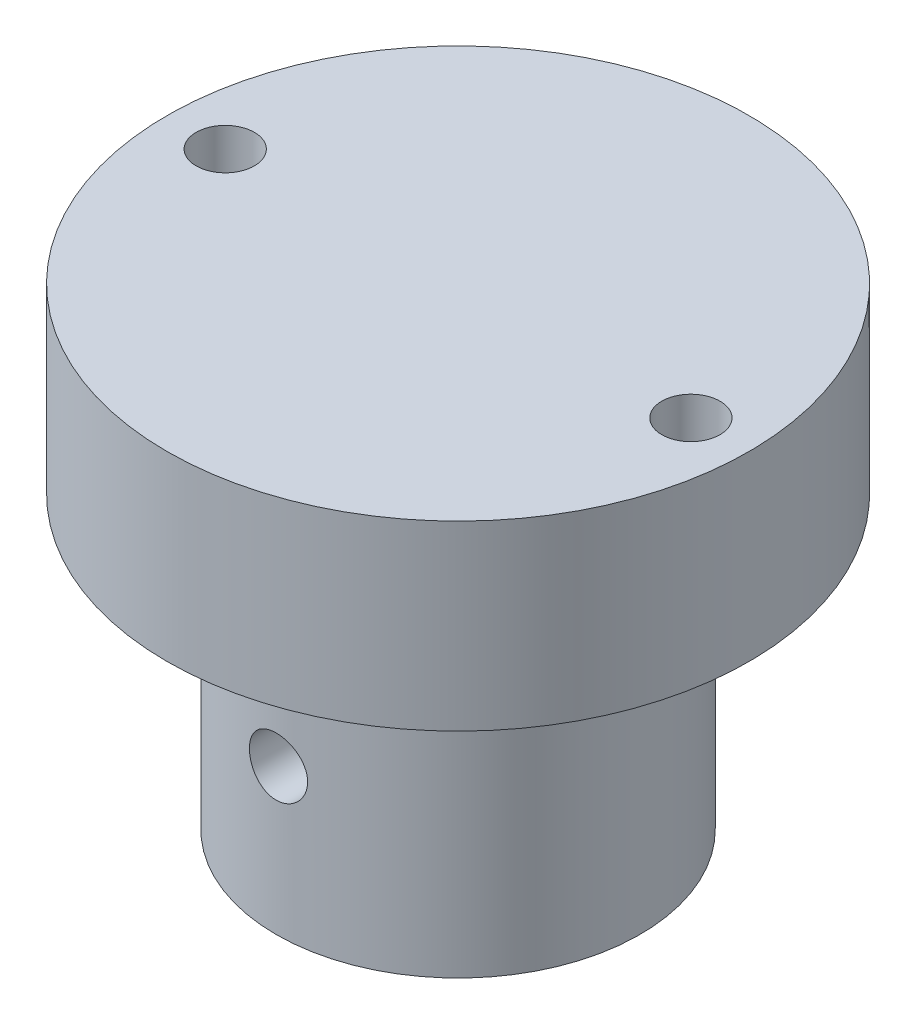
ISO-10303-21;
HEADER;
FILE_DESCRIPTION(('STEP AP214'),'2;1');
FILE_NAME('part.step','',(''),(''),'','','');
FILE_SCHEMA(('AUTOMOTIVE_DESIGN { 1 0 10303 214 1 1 1 1 }'));
ENDSEC;
DATA;
#1=APPLICATION_CONTEXT('core data for automotive mechanical design processes');
#2=APPLICATION_PROTOCOL_DEFINITION('international standard','automotive_design',2000,#1);
#3=PRODUCT_CONTEXT('',#1,'mechanical');
#4=PRODUCT('Part','Part','',(#3));
#5=PRODUCT_RELATED_PRODUCT_CATEGORY('part','',(#4));
#6=PRODUCT_DEFINITION_FORMATION('','',#4);
#7=PRODUCT_DEFINITION_CONTEXT('part definition',#1,'design');
#8=PRODUCT_DEFINITION('design','',#6,#7);
#9=PRODUCT_DEFINITION_SHAPE('','',#8);
#10=(LENGTH_UNIT() NAMED_UNIT(*) SI_UNIT(.MILLI.,.METRE.));
#11=(NAMED_UNIT(*) PLANE_ANGLE_UNIT() SI_UNIT($,.RADIAN.));
#12=(NAMED_UNIT(*) SI_UNIT($,.STERADIAN.) SOLID_ANGLE_UNIT());
#13=UNCERTAINTY_MEASURE_WITH_UNIT(LENGTH_MEASURE(1.E-05),#10,'distance_accuracy_value','');
#14=(GEOMETRIC_REPRESENTATION_CONTEXT(3) GLOBAL_UNCERTAINTY_ASSIGNED_CONTEXT((#13)) GLOBAL_UNIT_ASSIGNED_CONTEXT((#10,
#11,#12)) REPRESENTATION_CONTEXT('',''));
#15=CARTESIAN_POINT('',(0.,0.,0.));
#16=DIRECTION('',(0.,0.,1.));
#17=DIRECTION('',(1.,0.,0.));
#18=AXIS2_PLACEMENT_3D('',#15,#16,#17);
#19=CARTESIAN_POINT('',(0.,10.16,0.));
#20=DIRECTION('',(0.,-1.,0.));
#21=DIRECTION('',(0.,0.,-1.));
#22=AXIS2_PLACEMENT_3D('',#19,#20,#21);
#23=CYLINDRICAL_SURFACE('',#22,6.35);
#24=CARTESIAN_POINT('',(0.,0.,0.));
#25=DIRECTION('',(0.,1.,0.));
#26=DIRECTION('',(0.,0.,1.));
#27=AXIS2_PLACEMENT_3D('',#24,#25,#26);
#28=CIRCLE('',#27,6.35);
#29=CARTESIAN_POINT('',(0.,0.,6.35));
#30=VERTEX_POINT('',#29);
#31=EDGE_CURVE('E46',#30,#30,#28,.T.);
#32=ORIENTED_EDGE('',*,*,#31,.T.);
#33=EDGE_LOOP('',(#32));
#34=FACE_BOUND('',#33,.T.);
#35=CARTESIAN_POINT('',(-1.016,5.08,6.26819304106056));
#36=CARTESIAN_POINT('',(-1.01599769504324,5.13667589140187,6.26819403551404));
#37=CARTESIAN_POINT('',(-1.01124159204673,5.19338353794778,6.26897004691585));
#38=CARTESIAN_POINT('',(-0.992349783147829,5.30521003843499,6.27198771662539));
#39=CARTESIAN_POINT('',(-0.978205221741949,5.36032734104515,6.2742307586555));
#40=CARTESIAN_POINT('',(-0.94097334251936,5.46733847506112,6.27992208580791));
#41=CARTESIAN_POINT('',(-0.917893246383186,5.51923487039731,6.28336939742283));
#42=CARTESIAN_POINT('',(-0.86346305157436,5.61841217203581,6.29107968557929));
#43=CARTESIAN_POINT('',(-0.832113968966905,5.66569364442702,6.29534256188933));
#44=CARTESIAN_POINT('',(-0.761731472401225,5.75473521786042,6.30424698435201));
#45=CARTESIAN_POINT('',(-0.722637613434505,5.7964472668791,6.30889132920186));
#46=CARTESIAN_POINT('',(-0.6380058858614,5.87274896550724,6.31801047882019));
#47=CARTESIAN_POINT('',(-0.592467647153622,5.90733820577275,6.32248527383266));
#48=CARTESIAN_POINT('',(-0.495929877850886,5.96859154833621,6.33079062048891));
#49=CARTESIAN_POINT('',(-0.444901748992711,5.99521111869177,6.33461750200122));
#50=CARTESIAN_POINT('',(-0.339027005912608,6.03948344504246,6.34116475032308));
#51=CARTESIAN_POINT('',(-0.284180620955612,6.05713673888526,6.34388518350168));
#52=CARTESIAN_POINT('',(-0.172722097504602,6.08282895413612,6.34789326388865));
#53=CARTESIAN_POINT('',(-0.116128984586578,6.09094850865779,6.34919292097404));
#54=CARTESIAN_POINT('',(-0.00236972222130401,6.09759334610754,6.35025423457713));
#55=CARTESIAN_POINT('',(0.0547963909724093,6.09611923224563,6.35001598779185));
#56=CARTESIAN_POINT('',(0.167528095717094,6.08368176927201,6.34803788122686));
#57=CARTESIAN_POINT('',(0.223103535159279,6.07280518520236,6.34631175189527));
#58=CARTESIAN_POINT('',(0.331630194115818,6.04200797457068,6.34156712875674));
#59=CARTESIAN_POINT('',(0.384581338647916,6.02208708975682,6.33854859804658));
#60=CARTESIAN_POINT('',(0.486616241095792,5.97367946298034,6.33153486057529));
#61=CARTESIAN_POINT('',(0.535682593094869,5.94515665048293,6.32753555457914));
#62=CARTESIAN_POINT('',(0.628365353157727,5.88038121426257,6.31900517323919));
#63=CARTESIAN_POINT('',(0.6719813535878,5.84412801292924,6.31447405817029));
#64=CARTESIAN_POINT('',(0.753037465593561,5.7644387817114,6.30532473766966));
#65=CARTESIAN_POINT('',(0.790403046173726,5.72092694987282,6.30070612498814));
#66=CARTESIAN_POINT('',(0.8573144186034,5.62821187981386,6.29195154361697));
#67=CARTESIAN_POINT('',(0.886860148838747,5.57900859675378,6.28781557873035));
#68=CARTESIAN_POINT('',(0.937305880666645,5.47622450094184,6.28049450273244));
#69=CARTESIAN_POINT('',(0.958197450743346,5.42263947974057,6.27731031975346));
#70=CARTESIAN_POINT('',(0.990662758380679,5.31265860420519,6.27226911110825));
#71=CARTESIAN_POINT('',(1.00223724835111,5.25626297723492,6.27041197827617));
#72=CARTESIAN_POINT('',(1.01563601798795,5.14292706608188,6.26825571297972));
#73=CARTESIAN_POINT('',(1.0175662979846,5.08599962494034,6.26793964349315));
#74=CARTESIAN_POINT('',(1.01190383114509,4.97263472513705,6.26885623915126));
#75=CARTESIAN_POINT('',(1.00431142214299,4.91619724916445,6.27008884935381));
#76=CARTESIAN_POINT('',(0.979909280740693,4.80574761203425,6.27394830907495));
#77=CARTESIAN_POINT('',(0.963153030988743,4.75172332702417,6.2765670658449));
#78=CARTESIAN_POINT('',(0.920954759109688,4.64724984339553,6.2828970086701));
#79=CARTESIAN_POINT('',(0.895512254331345,4.59680084362561,6.28660825542792));
#80=CARTESIAN_POINT('',(0.836411663304454,4.50043682431462,6.29474459515927));
#81=CARTESIAN_POINT('',(0.802685364876786,4.45456413958641,6.29917550591062));
#82=CARTESIAN_POINT('',(0.728068669578291,4.36909156119654,6.30823469948976));
#83=CARTESIAN_POINT('',(0.687177809748396,4.32949207321086,6.31286299505751));
#84=CARTESIAN_POINT('',(0.598924255479659,4.25730553561683,6.32184877776935));
#85=CARTESIAN_POINT('',(0.551503536204841,4.22478899561172,6.3262032598522));
#86=CARTESIAN_POINT('',(0.451811058473387,4.16818417263784,6.3341032066333));
#87=CARTESIAN_POINT('',(0.399539447287974,4.14409563390402,6.33764869588096));
#88=CARTESIAN_POINT('',(0.291842838763925,4.10514153619851,6.34351807238694));
#89=CARTESIAN_POINT('',(0.236431715654078,4.09023840003212,6.34584693079896));
#90=CARTESIAN_POINT('',(0.123853069651673,4.06995689111261,6.34904160254437));
#91=CARTESIAN_POINT('',(0.0666856798149288,4.06457779861375,6.34990752643362));
#92=CARTESIAN_POINT('',(-0.0471008256588229,4.06351648657573,6.35007738794596));
#93=CARTESIAN_POINT('',(-0.103718941549757,4.06772673910333,6.34939864639168));
#94=CARTESIAN_POINT('',(-0.215430776217704,4.08549288984209,6.34659062021428));
#95=CARTESIAN_POINT('',(-0.270524501947229,4.09904874542205,6.34446134220797));
#96=CARTESIAN_POINT('',(-0.377587318541396,4.13508130301258,6.33899051703869));
#97=CARTESIAN_POINT('',(-0.42955931478101,4.15754955740056,6.33565011809443));
#98=CARTESIAN_POINT('',(-0.529012504739116,4.21075736987234,6.32812262419089));
#99=CARTESIAN_POINT('',(-0.576493512733801,4.24149726982623,6.3239354942377));
#100=CARTESIAN_POINT('',(-0.666160156866185,4.31076014675583,6.31512349568329));
#101=CARTESIAN_POINT('',(-0.708284350860755,4.34936214351927,6.31049445883438));
#102=CARTESIAN_POINT('',(-0.785495604939363,4.43308733338062,6.30135003139344));
#103=CARTESIAN_POINT('',(-0.820581013885812,4.47821205229844,6.29683466768324));
#104=CARTESIAN_POINT('',(-0.882925294022889,4.57404682035764,6.28839740566688));
#105=CARTESIAN_POINT('',(-0.910132119839209,4.62479108075766,6.28447953129439));
#106=CARTESIAN_POINT('',(-0.955594646553645,4.73017001117662,6.27772822250236));
#107=CARTESIAN_POINT('',(-0.973859433240997,4.78480066739026,6.27489368797267));
#108=CARTESIAN_POINT('',(-0.996878807164912,4.8797148827213,6.27126949983991));
#109=CARTESIAN_POINT('',(-1.00403797217713,4.91941880908197,6.27012211869688));
#110=CARTESIAN_POINT('',(-1.0135993503463,4.99940981043834,6.26858354172928));
#111=CARTESIAN_POINT('',(-1.01600163909125,5.03969687615756,6.26819233388894));
#112=CARTESIAN_POINT('',(-1.016,5.08,6.26819304106056));
#113=B_SPLINE_CURVE_WITH_KNOTS('',3,(#35,#36,#37,#38,#39,#40,#41,#42,#43,#44,#45,#46,#47,#48,
#49,#50,#51,#52,#53,#54,#55,#56,#57,#58,#59,#60,#61,#62,#63,#64,#65,#66,#67,#68,#69,#70,#71,#72,
#73,#74,#75,#76,#77,#78,#79,#80,#81,#82,#83,#84,#85,#86,#87,#88,#89,#90,#91,#92,#93,#94,#95,#96,
#97,#98,#99,#100,#101,#102,#103,#104,#105,#106,#107,#108,#109,#110,#111,#112),.UNSPECIFIED.,.T.,
.F.,(4,2,2,2,2,2,2,2,2,2,2,2,2,2,2,2,2,2,2,2,2,2,2,2,2,2,2,2,2,2,2,2,2,2,2,2,2,2,4),(0.,
0.169880321882361,0.339921108625201,0.509824754680403,0.679707533265704,0.850972488209638,
1.02224728291215,1.19446197226048,1.36666632998338,1.53740350435707,1.70812994359012,
1.87729755271594,2.04646999257357,2.21636192832832,2.38626656276549,2.5580715124197,
2.72987781571911,2.90185111382296,3.07381052266342,3.24387568815821,3.41393482046424,
3.58301187235558,3.75209832053258,3.92262673906721,4.09316618086042,4.26533272103383,
4.43749403600587,4.60894628660576,4.78038557975853,4.94991195458607,5.11943755610198,
5.28880285517363,5.45817515524958,5.62934216298827,5.80054927575461,5.97286283661862,
6.14500094858956,6.26580745520847,6.38661204216541),.UNSPECIFIED.);
#114=CARTESIAN_POINT('',(-1.016,5.08,6.26819304106056));
#115=VERTEX_POINT('',#114);
#116=EDGE_CURVE('E98',#115,#115,#113,.T.);
#117=ORIENTED_EDGE('',*,*,#116,.T.);
#118=EDGE_LOOP('',(#117));
#119=FACE_BOUND('',#118,.T.);
#120=CARTESIAN_POINT('',(1.016,5.08,-6.26819304106056));
#121=CARTESIAN_POINT('',(1.01599769504324,5.02332410859813,-6.26819403551404));
#122=CARTESIAN_POINT('',(1.01124159204673,4.96661646205222,-6.26897004691585));
#123=CARTESIAN_POINT('',(0.992349783147829,4.85478996156501,-6.27198771662539));
#124=CARTESIAN_POINT('',(0.978205221741949,4.79967265895485,-6.2742307586555));
#125=CARTESIAN_POINT('',(0.940973342519359,4.69266152493888,-6.27992208580791));
#126=CARTESIAN_POINT('',(0.917893246383186,4.64076512960269,-6.28336939742283));
#127=CARTESIAN_POINT('',(0.863463051574359,4.54158782796419,-6.29107968557929));
#128=CARTESIAN_POINT('',(0.832113968966905,4.49430635557297,-6.29534256188933));
#129=CARTESIAN_POINT('',(0.761731472401225,4.40526478213958,-6.30424698435201));
#130=CARTESIAN_POINT('',(0.722637613434505,4.3635527331209,-6.30889132920186));
#131=CARTESIAN_POINT('',(0.6380058858614,4.28725103449276,-6.31801047882019));
#132=CARTESIAN_POINT('',(0.592467647153622,4.25266179422725,-6.32248527383266));
#133=CARTESIAN_POINT('',(0.495929877850886,4.19140845166379,-6.33079062048891));
#134=CARTESIAN_POINT('',(0.444901748992711,4.16478888130823,-6.33461750200122));
#135=CARTESIAN_POINT('',(0.339027005912608,4.12051655495754,-6.34116475032308));
#136=CARTESIAN_POINT('',(0.284180620955612,4.10286326111474,-6.34388518350168));
#137=CARTESIAN_POINT('',(0.172722097504602,4.07717104586388,-6.34789326388865));
#138=CARTESIAN_POINT('',(0.116128984586579,4.06905149134221,-6.34919292097404));
#139=CARTESIAN_POINT('',(0.00236972222130401,4.06240665389246,-6.35025423457713));
#140=CARTESIAN_POINT('',(-0.0547963909724093,4.06388076775437,-6.35001598779185));
#141=CARTESIAN_POINT('',(-0.167528095717094,4.07631823072799,-6.34803788122686));
#142=CARTESIAN_POINT('',(-0.223103535159278,4.08719481479764,-6.34631175189527));
#143=CARTESIAN_POINT('',(-0.331630194115818,4.11799202542932,-6.34156712875674));
#144=CARTESIAN_POINT('',(-0.384581338647916,4.13791291024318,-6.33854859804658));
#145=CARTESIAN_POINT('',(-0.486616241095792,4.18632053701966,-6.33153486057529));
#146=CARTESIAN_POINT('',(-0.535682593094869,4.21484334951707,-6.32753555457914));
#147=CARTESIAN_POINT('',(-0.628365353157727,4.27961878573743,-6.31900517323919));
#148=CARTESIAN_POINT('',(-0.6719813535878,4.31587198707076,-6.31447405817029));
#149=CARTESIAN_POINT('',(-0.753037465593561,4.3955612182886,-6.30532473766966));
#150=CARTESIAN_POINT('',(-0.790403046173727,4.43907305012718,-6.30070612498814));
#151=CARTESIAN_POINT('',(-0.857314418603401,4.53178812018614,-6.29195154361697));
#152=CARTESIAN_POINT('',(-0.886860148838748,4.58099140324622,-6.28781557873035));
#153=CARTESIAN_POINT('',(-0.937305880666646,4.68377549905816,-6.28049450273244));
#154=CARTESIAN_POINT('',(-0.958197450743346,4.73736052025943,-6.27731031975346));
#155=CARTESIAN_POINT('',(-0.99066275838068,4.84734139579481,-6.27226911110825));
#156=CARTESIAN_POINT('',(-1.00223724835111,4.90373702276508,-6.27041197827617));
#157=CARTESIAN_POINT('',(-1.01563601798795,5.01707293391812,-6.26825571297972));
#158=CARTESIAN_POINT('',(-1.0175662979846,5.07400037505966,-6.26793964349315));
#159=CARTESIAN_POINT('',(-1.01190383114509,5.18736527486295,-6.26885623915126));
#160=CARTESIAN_POINT('',(-1.00431142214299,5.24380275083555,-6.27008884935381));
#161=CARTESIAN_POINT('',(-0.979909280740693,5.35425238796575,-6.27394830907495));
#162=CARTESIAN_POINT('',(-0.963153030988743,5.40827667297583,-6.2765670658449));
#163=CARTESIAN_POINT('',(-0.920954759109688,5.51275015660447,-6.2828970086701));
#164=CARTESIAN_POINT('',(-0.895512254331344,5.56319915637439,-6.28660825542792));
#165=CARTESIAN_POINT('',(-0.836411663304454,5.65956317568538,-6.29474459515927));
#166=CARTESIAN_POINT('',(-0.802685364876785,5.70543586041359,-6.29917550591062));
#167=CARTESIAN_POINT('',(-0.72806866957829,5.79090843880346,-6.30823469948976));
#168=CARTESIAN_POINT('',(-0.687177809748396,5.83050792678914,-6.31286299505751));
#169=CARTESIAN_POINT('',(-0.598924255479659,5.90269446438317,-6.32184877776935));
#170=CARTESIAN_POINT('',(-0.551503536204841,5.93521100438828,-6.3262032598522));
#171=CARTESIAN_POINT('',(-0.451811058473387,5.99181582736216,-6.3341032066333));
#172=CARTESIAN_POINT('',(-0.399539447287974,6.01590436609598,-6.33764869588096));
#173=CARTESIAN_POINT('',(-0.291842838763925,6.0548584638015,-6.34351807238694));
#174=CARTESIAN_POINT('',(-0.236431715654078,6.06976159996788,-6.34584693079896));
#175=CARTESIAN_POINT('',(-0.123853069651672,6.0900431088874,-6.34904160254437));
#176=CARTESIAN_POINT('',(-0.0666856798149287,6.09542220138625,-6.34990752643362));
#177=CARTESIAN_POINT('',(0.0471008256588229,6.09648351342427,-6.35007738794596));
#178=CARTESIAN_POINT('',(0.103718941549757,6.09227326089667,-6.34939864639168));
#179=CARTESIAN_POINT('',(0.215430776217704,6.07450711015791,-6.34659062021428));
#180=CARTESIAN_POINT('',(0.270524501947229,6.06095125457795,-6.34446134220797));
#181=CARTESIAN_POINT('',(0.377587318541396,6.02491869698742,-6.33899051703869));
#182=CARTESIAN_POINT('',(0.42955931478101,6.00245044259944,-6.33565011809443));
#183=CARTESIAN_POINT('',(0.529012504739117,5.94924263012766,-6.32812262419089));
#184=CARTESIAN_POINT('',(0.576493512733801,5.91850273017377,-6.3239354942377));
#185=CARTESIAN_POINT('',(0.666160156866185,5.84923985324417,-6.31512349568329));
#186=CARTESIAN_POINT('',(0.708284350860756,5.81063785648074,-6.31049445883438));
#187=CARTESIAN_POINT('',(0.785495604939363,5.72691266661938,-6.30135003139344));
#188=CARTESIAN_POINT('',(0.820581013885812,5.68178794770156,-6.29683466768324));
#189=CARTESIAN_POINT('',(0.882925294022889,5.58595317964236,-6.28839740566688));
#190=CARTESIAN_POINT('',(0.910132119839209,5.53520891924234,-6.28447953129439));
#191=CARTESIAN_POINT('',(0.955594646553645,5.42982998882338,-6.27772822250236));
#192=CARTESIAN_POINT('',(0.973859433240997,5.37519933260974,-6.27489368797267));
#193=CARTESIAN_POINT('',(0.996878807164912,5.2802851172787,-6.27126949983991));
#194=CARTESIAN_POINT('',(1.00403797217713,5.24058119091803,-6.27012211869688));
#195=CARTESIAN_POINT('',(1.0135993503463,5.16059018956166,-6.26858354172928));
#196=CARTESIAN_POINT('',(1.01600163909125,5.12030312384244,-6.26819233388894));
#197=CARTESIAN_POINT('',(1.016,5.08,-6.26819304106056));
#198=B_SPLINE_CURVE_WITH_KNOTS('',3,(#120,#121,#122,#123,#124,#125,#126,#127,#128,#129,#130,
#131,#132,#133,#134,#135,#136,#137,#138,#139,#140,#141,#142,#143,#144,#145,#146,#147,#148,#149,
#150,#151,#152,#153,#154,#155,#156,#157,#158,#159,#160,#161,#162,#163,#164,#165,#166,#167,#168,
#169,#170,#171,#172,#173,#174,#175,#176,#177,#178,#179,#180,#181,#182,#183,#184,#185,#186,#187,
#188,#189,#190,#191,#192,#193,#194,#195,#196,#197),.UNSPECIFIED.,.T.,.F.,(4,2,2,2,2,2,2,2,2,2,2,
2,2,2,2,2,2,2,2,2,2,2,2,2,2,2,2,2,2,2,2,2,2,2,2,2,2,2,4),(0.,0.169880321882361,
0.339921108625201,0.509824754680405,0.679707533265703,0.850972488209639,1.02224728291215,
1.19446197226048,1.36666632998338,1.53740350435707,1.70812994359012,1.87729755271594,
2.04646999257357,2.21636192832832,2.38626656276549,2.5580715124197,2.72987781571911,
2.90185111382296,3.07381052266342,3.24387568815821,3.41393482046425,3.58301187235559,
3.75209832053258,3.92262673906721,4.09316618086042,4.26533272103383,4.43749403600587,
4.60894628660576,4.78038557975853,4.94991195458607,5.11943755610198,5.28880285517363,
5.45817515524958,5.62934216298827,5.80054927575461,5.97286283661862,6.14500094858956,
6.26580745520847,6.38661204216541),.UNSPECIFIED.);
#199=CARTESIAN_POINT('',(1.016,5.08,-6.26819304106056));
#200=VERTEX_POINT('',#199);
#201=EDGE_CURVE('E70',#200,#200,#198,.T.);
#202=ORIENTED_EDGE('',*,*,#201,.F.);
#203=EDGE_LOOP('',(#202));
#204=FACE_BOUND('',#203,.T.);
#205=CARTESIAN_POINT('',(0.,10.16,0.));
#206=DIRECTION('',(0.,1.,0.));
#207=DIRECTION('',(0.,0.,1.));
#208=AXIS2_PLACEMENT_3D('',#205,#206,#207);
#209=CIRCLE('',#208,6.35);
#210=CARTESIAN_POINT('',(0.,10.16,6.35));
#211=VERTEX_POINT('',#210);
#212=EDGE_CURVE('E10',#211,#211,#209,.T.);
#213=ORIENTED_EDGE('',*,*,#212,.F.);
#214=EDGE_LOOP('',(#213));
#215=FACE_BOUND('',#214,.T.);
#216=ADVANCED_FACE('F39',(#34,#119,#204,#215),#23,.T.);
#217=CARTESIAN_POINT('',(0.,0.,0.));
#218=DIRECTION('',(0.,1.,0.));
#219=DIRECTION('',(0.,0.,1.));
#220=AXIS2_PLACEMENT_3D('',#217,#218,#219);
#221=PLANE('',#220);
#222=CARTESIAN_POINT('',(0.,0.,0.));
#223=DIRECTION('',(0.,1.,0.));
#224=DIRECTION('',(0.,0.,1.));
#225=AXIS2_PLACEMENT_3D('',#222,#223,#224);
#226=CIRCLE('',#225,4.7625);
#227=CARTESIAN_POINT('',(0.,0.,4.7625));
#228=VERTEX_POINT('',#227);
#229=EDGE_CURVE('E51',#228,#228,#226,.F.);
#230=ORIENTED_EDGE('',*,*,#229,.F.);
#231=EDGE_LOOP('',(#230));
#232=FACE_BOUND('',#231,.T.);
#233=ORIENTED_EDGE('',*,*,#31,.F.);
#234=EDGE_LOOP('',(#233));
#235=FACE_BOUND('',#234,.T.);
#236=ADVANCED_FACE('F115',(#232,#235),#221,.F.);
#237=CARTESIAN_POINT('',(0.,-13.4703841816037,0.));
#238=DIRECTION('',(0.,1.,0.));
#239=DIRECTION('',(0.,0.,1.));
#240=AXIS2_PLACEMENT_3D('',#237,#238,#239);
#241=CYLINDRICAL_SURFACE('',#240,4.7625);
#242=CARTESIAN_POINT('',(0.,4.064,4.7625));
#243=CARTESIAN_POINT('',(0.0563844626269982,4.06400197218595,4.76249895673298));
#244=CARTESIAN_POINT('',(0.112793074959932,4.06870956289452,4.76148846913532));
#245=CARTESIAN_POINT('',(0.224010350170093,4.08739736149324,4.75755499453595));
#246=CARTESIAN_POINT('',(0.278817800645456,4.10138441505622,4.75463059561945));
#247=CARTESIAN_POINT('',(0.385209148414719,4.1381749544907,4.74719518742165));
#248=CARTESIAN_POINT('',(0.436796268547741,4.16096945625211,4.74268579534767));
#249=CARTESIAN_POINT('',(0.53541152615669,4.21469985582769,4.73256813284778));
#250=CARTESIAN_POINT('',(0.582439826614029,4.24563546244394,4.72695990172791));
#251=CARTESIAN_POINT('',(0.671324662992692,4.31527129734554,4.71516380296902));
#252=CARTESIAN_POINT('',(0.713101409348593,4.35407221202044,4.70896903969119));
#253=CARTESIAN_POINT('',(0.789605682168651,4.43812100441461,4.69674711588073));
#254=CARTESIAN_POINT('',(0.824332604114973,4.4833694344384,4.69071996975937));
#255=CARTESIAN_POINT('',(0.886099813821638,4.57961402786303,4.67944791154241));
#256=CARTESIAN_POINT('',(0.913055847892545,4.63066539150595,4.67421184666522));
#257=CARTESIAN_POINT('',(0.957975859641681,4.73670332623058,4.66521347578965));
#258=CARTESIAN_POINT('',(0.975940856432099,4.79168945050883,4.66145100277374));
#259=CARTESIAN_POINT('',(1.00210651455278,4.90317257813505,4.65589591491856));
#260=CARTESIAN_POINT('',(1.01044807248282,4.95963506763405,4.65407490599859));
#261=CARTESIAN_POINT('',(1.01756803147105,5.07318520803569,4.65252359691289));
#262=CARTESIAN_POINT('',(1.01634754887166,5.13027278518395,4.65279305269101));
#263=CARTESIAN_POINT('',(1.00449161438515,5.24241011175321,4.65536649423502));
#264=CARTESIAN_POINT('',(0.994019193338168,5.29747802841131,4.65763524810735));
#265=CARTESIAN_POINT('',(0.964214663101186,5.40505691382844,4.66389601929689));
#266=CARTESIAN_POINT('',(0.944882078639877,5.45756774525473,4.6678881290566));
#267=CARTESIAN_POINT('',(0.897754543284647,5.55900359713452,4.67718090584143));
#268=CARTESIAN_POINT('',(0.869896333842204,5.60789829954254,4.68249129666887));
#269=CARTESIAN_POINT('',(0.806552865029542,5.70037957790027,4.69381624331275));
#270=CARTESIAN_POINT('',(0.771066614099411,5.74396546260813,4.69983089062834));
#271=CARTESIAN_POINT('',(0.692608449372287,5.82553111873822,4.71203825492389));
#272=CARTESIAN_POINT('',(0.649497749592723,5.86337734984353,4.71823209190476));
#273=CARTESIAN_POINT('',(0.557472061775644,5.93132380769153,4.72998725753749));
#274=CARTESIAN_POINT('',(0.508556978312316,5.96142390705971,4.7355485757876));
#275=CARTESIAN_POINT('',(0.406152401960311,6.01305418862972,4.74542878662929));
#276=CARTESIAN_POINT('',(0.352654170437358,6.03456753604906,4.74974523403599));
#277=CARTESIAN_POINT('',(0.242689727547827,6.06826278166471,4.75663108108472));
#278=CARTESIAN_POINT('',(0.186223927456014,6.08044596930084,4.75920072213205));
#279=CARTESIAN_POINT('',(0.0730732895603533,6.09494236316675,4.76226928636029));
#280=CARTESIAN_POINT('',(0.0164128428785989,6.0974380843006,4.76280649620917));
#281=CARTESIAN_POINT('',(-0.0965153559452791,6.09298246018006,4.76185667827924));
#282=CARTESIAN_POINT('',(-0.152783133125557,6.08603172290481,4.76036978077304));
#283=CARTESIAN_POINT('',(-0.26272874961146,6.06303192698763,4.75556291925799));
#284=CARTESIAN_POINT('',(-0.316427398217916,6.04707798168652,4.75226212732976));
#285=CARTESIAN_POINT('',(-0.420386761328544,6.0066297292361,4.74419668083851));
#286=CARTESIAN_POINT('',(-0.470647192553413,5.98213471938844,4.73943190583314));
#287=CARTESIAN_POINT('',(-0.567062588740857,5.92491507761741,4.72887226744177));
#288=CARTESIAN_POINT('',(-0.613151973933935,5.89208243316308,4.72306420231049));
#289=CARTESIAN_POINT('',(-0.699232510619353,5.81926245592079,4.71109034202162));
#290=CARTESIAN_POINT('',(-0.739222910204586,5.77927424228451,4.70492450288537));
#291=CARTESIAN_POINT('',(-0.8126868275149,5.69244261583642,4.69279871582542));
#292=CARTESIAN_POINT('',(-0.846034271432796,5.64549163418586,4.6868442476404));
#293=CARTESIAN_POINT('',(-0.90437086908975,5.5465480181901,4.67593882398893));
#294=CARTESIAN_POINT('',(-0.929360377887899,5.49455559813471,4.67098782589691));
#295=CARTESIAN_POINT('',(-0.970107325899269,5.38727994483906,4.66269566041667));
#296=CARTESIAN_POINT('',(-0.985915651792795,5.33201675798573,4.65934563831652));
#297=CARTESIAN_POINT('',(-1.00800226948227,5.21953824906641,4.65461787533928));
#298=CARTESIAN_POINT('',(-1.0142820003555,5.1623232231161,4.65323983664081));
#299=CARTESIAN_POINT('',(-1.01707426037763,5.04883467162915,4.65263018010158));
#300=CARTESIAN_POINT('',(-1.01378647180097,4.99256620194681,4.65335467962954));
#301=CARTESIAN_POINT('',(-0.997981735336247,4.8814046373794,4.65676957783197));
#302=CARTESIAN_POINT('',(-0.985464885429201,4.82651152789911,4.65945995563555));
#303=CARTESIAN_POINT('',(-0.951651657537014,4.71980815966414,4.6664825982999));
#304=CARTESIAN_POINT('',(-0.930382987590451,4.66798875675569,4.6708096779428));
#305=CARTESIAN_POINT('',(-0.879694180993217,4.56862365185605,4.68062046117072));
#306=CARTESIAN_POINT('',(-0.850273243242921,4.52107837047878,4.68610427841231));
#307=CARTESIAN_POINT('',(-0.783446902673266,4.43062380481957,4.69774268223457));
#308=CARTESIAN_POINT('',(-0.745898620808694,4.38782145785911,4.70390815442029));
#309=CARTESIAN_POINT('',(-0.664174661027307,4.30905949708915,4.71614058952408));
#310=CARTESIAN_POINT('',(-0.619997456785978,4.27310146353533,4.72220752939737));
#311=CARTESIAN_POINT('',(-0.525620103169967,4.20863011494492,4.73364704227093));
#312=CARTESIAN_POINT('',(-0.475353001223227,4.18021305821916,4.73901023281778));
#313=CARTESIAN_POINT('',(-0.370653335418522,4.13227583591658,4.74834441943046));
#314=CARTESIAN_POINT('',(-0.316224390091353,4.11274804199504,4.75231660850988));
#315=CARTESIAN_POINT('',(-0.218100124570983,4.08671410054972,4.75769368190114));
#316=CARTESIAN_POINT('',(-0.174944300637535,4.07821224319641,4.75948507228609));
#317=CARTESIAN_POINT('',(-0.0878638522627294,4.06685453836095,4.7618886140483));
#318=CARTESIAN_POINT('',(-0.043939258907308,4.06399846311581,4.76250081299666));
#319=CARTESIAN_POINT('',(0.,4.064,4.7625));
#320=B_SPLINE_CURVE_WITH_KNOTS('',3,(#242,#243,#244,#245,#246,#247,#248,#249,#250,#251,#252,
#253,#254,#255,#256,#257,#258,#259,#260,#261,#262,#263,#264,#265,#266,#267,#268,#269,#270,#271,
#272,#273,#274,#275,#276,#277,#278,#279,#280,#281,#282,#283,#284,#285,#286,#287,#288,#289,#290,
#291,#292,#293,#294,#295,#296,#297,#298,#299,#300,#301,#302,#303,#304,#305,#306,#307,#308,#309,
#310,#311,#312,#313,#314,#315,#316,#317,#318,#319),.UNSPECIFIED.,.T.,.F.,(4,2,2,2,2,2,2,2,2,2,2,
2,2,2,2,2,2,2,2,2,2,2,2,2,2,2,2,2,2,2,2,2,2,2,2,2,2,2,4),(0.,0.168992580387775,
0.338109969319217,0.507055302161209,0.675994592844598,0.847251218816111,1.0185225237342,
1.19158638441572,1.36463062428471,1.53510782090322,1.70556511506571,1.87307734451114,
2.04059856059405,2.20939419332268,2.37821178087482,2.55049693260358,2.72278491714456,
2.89540904151401,3.06800930470524,3.2373414755477,3.40666274859645,3.57422786165849,
3.7418067640464,3.91167848623336,4.08157113397952,4.25443220932223,4.42728594030375,
4.59917225493719,4.77103260747243,4.93933197990242,5.10762956559519,5.27539837560668,
5.44318367762093,5.61420081535429,5.78525739076936,5.95840251613624,6.1313987751364,
6.26309655094659,6.39478901367686),.UNSPECIFIED.);
#321=CARTESIAN_POINT('',(0.,4.064,4.7625));
#322=VERTEX_POINT('',#321);
#323=EDGE_CURVE('E69',#322,#322,#320,.T.);
#324=ORIENTED_EDGE('',*,*,#323,.T.);
#325=EDGE_LOOP('',(#324));
#326=FACE_BOUND('',#325,.T.);
#327=CARTESIAN_POINT('',(1.016,5.08,-4.65286473583748));
#328=CARTESIAN_POINT('',(1.01599801576459,5.02363199611472,-4.65286587355159));
#329=CARTESIAN_POINT('',(1.01129307972245,4.96723981197879,-4.65390020873217));
#330=CARTESIAN_POINT('',(0.992616780304669,4.8560566408187,-4.65791864150835));
#331=CARTESIAN_POINT('',(0.978638505946928,4.80126687982467,-4.66090419322901));
#332=CARTESIAN_POINT('',(0.941873629948345,4.69491300875087,-4.66847189208986));
#333=CARTESIAN_POINT('',(0.919096424076568,4.64334552583238,-4.67305233564265));
#334=CARTESIAN_POINT('',(0.865406803845663,4.5447634157256,-4.68329167418235));
#335=CARTESIAN_POINT('',(0.834494641415611,4.49774864760731,-4.68895053577054));
#336=CARTESIAN_POINT('',(0.764882917069572,4.40884955213112,-4.70081072765601));
#337=CARTESIAN_POINT('',(0.726077399805327,4.36704906536019,-4.70701870855264));
#338=CARTESIAN_POINT('',(0.642009303727055,4.29049868193295,-4.71921934129388));
#339=CARTESIAN_POINT('',(0.596746238450537,4.25574931693261,-4.72521197687341));
#340=CARTESIAN_POINT('',(0.500487812751034,4.19395780008074,-4.73637893556834));
#341=CARTESIAN_POINT('',(0.449439766159015,4.16699600305621,-4.74154449775951));
#342=CARTESIAN_POINT('',(0.343408992865178,4.12206443471455,-4.75040028963118));
#343=CARTESIAN_POINT('',(0.2884266865581,4.1040937042935,-4.75409067666458));
#344=CARTESIAN_POINT('',(0.176959423376637,4.0779172888985,-4.75953331786731));
#345=CARTESIAN_POINT('',(0.120509163264131,4.06956979888488,-4.76131368945404));
#346=CARTESIAN_POINT('',(0.00698327740264822,4.06243373225018,-4.76283302707285));
#347=CARTESIAN_POINT('',(-0.0500922794704652,4.06364411320238,-4.76257221572606));
#348=CARTESIAN_POINT('',(-0.162271965507563,4.07548324073808,-4.7600601512617));
#349=CARTESIAN_POINT('',(-0.217393051880008,4.08595917012595,-4.75784119526682));
#350=CARTESIAN_POINT('',(-0.32507642769087,4.11578883797506,-4.75169884956543));
#351=CARTESIAN_POINT('',(-0.377638605097908,4.13514296474598,-4.74777538530848));
#352=CARTESIAN_POINT('',(-0.479139810629404,4.18231669521762,-4.7386125422121));
#353=CARTESIAN_POINT('',(-0.528050799680562,4.21019479961588,-4.7333641148739));
#354=CARTESIAN_POINT('',(-0.620556385989134,4.27358160752587,-4.72212775676388));
#355=CARTESIAN_POINT('',(-0.664150290930594,4.30909130305708,-4.71613972989567));
#356=CARTESIAN_POINT('',(-0.745692556840183,4.3875671921219,-4.70394354557891));
#357=CARTESIAN_POINT('',(-0.783512004187261,4.43066713698549,-4.69773337718632));
#358=CARTESIAN_POINT('',(-0.851409398130919,4.52266140472845,-4.68590435079412));
#359=CARTESIAN_POINT('',(-0.881487155009426,4.57155586956562,-4.68028550728753));
#360=CARTESIAN_POINT('',(-0.933100814054981,4.67395272913545,-4.67027038667192));
#361=CARTESIAN_POINT('',(-0.954613394604409,4.72746722847117,-4.66587745711669));
#362=CARTESIAN_POINT('',(-0.988302228565441,4.83746732841685,-4.65885867259004));
#363=CARTESIAN_POINT('',(-1.00047988358828,4.89395248163048,-4.65623255234473));
#364=CARTESIAN_POINT('',(-1.01495540045912,5.00711537309925,-4.65309855219237));
#365=CARTESIAN_POINT('',(-1.01744051117202,5.06376807485455,-4.65255053162509));
#366=CARTESIAN_POINT('',(-1.01296643735987,5.17667832595532,-4.65352665668286));
#367=CARTESIAN_POINT('',(-1.00600786765198,5.23293590078527,-4.65505066741133));
#368=CARTESIAN_POINT('',(-0.983006122743021,5.34281369356198,-4.65996132495301));
#369=CARTESIAN_POINT('',(-0.967065162986004,5.3964563324819,-4.66332700220772));
#370=CARTESIAN_POINT('',(-0.92666140620764,5.50030935704661,-4.6715230064747));
#371=CARTESIAN_POINT('',(-0.902197826525816,5.55051942696044,-4.6763534679977));
#372=CARTESIAN_POINT('',(-0.845027372661013,5.64689503910788,-4.68702355052558));
#373=CARTESIAN_POINT('',(-0.812204610327412,5.69299027831668,-4.69287696213641));
#374=CARTESIAN_POINT('',(-0.739399983920291,5.77908715204884,-4.70489661374079));
#375=CARTESIAN_POINT('',(-0.699417276194534,5.81908806745245,-4.71106289053763));
#376=CARTESIAN_POINT('',(-0.612582372440938,5.89258260974685,-4.72314520438194));
#377=CARTESIAN_POINT('',(-0.565621360424497,5.92594888548682,-4.72905490161764));
#378=CARTESIAN_POINT('',(-0.466651893822959,5.9843185022617,-4.7398434994514));
#379=CARTESIAN_POINT('',(-0.414643668672484,6.00932222320945,-4.74472244687296));
#380=CARTESIAN_POINT('',(-0.307371690627028,6.05007714389902,-4.75287298394571));
#381=CARTESIAN_POINT('',(-0.252130347809044,6.06588526718682,-4.75615444145243));
#382=CARTESIAN_POINT('',(-0.139698545848657,6.08797885014264,-4.76078283475008));
#383=CARTESIAN_POINT('',(-0.0825083566509153,6.09426562322336,-4.76213003735845));
#384=CARTESIAN_POINT('',(0.0309865827629288,6.09708141023559,-4.76273068322822));
#385=CARTESIAN_POINT('',(0.0872864749104618,6.0938009486539,-4.76202500874447));
#386=CARTESIAN_POINT('',(0.198512857553866,6.07799992160309,-4.75868629565214));
#387=CARTESIAN_POINT('',(0.253439370421762,6.06547950675213,-4.75605328846052));
#388=CARTESIAN_POINT('',(0.360220928577693,6.03164337544492,-4.74915823186809));
#389=CARTESIAN_POINT('',(0.412084479675825,6.01035346559589,-4.74490096497895));
#390=CARTESIAN_POINT('',(0.511529232397217,5.95960833262389,-4.73521310143927));
#391=CARTESIAN_POINT('',(0.559110039980568,5.93015235918579,-4.72978239698093));
#392=CARTESIAN_POINT('',(0.64957185032592,5.86328362381826,-4.71821812480735));
#393=CARTESIAN_POINT('',(0.692351902892584,5.8257361769139,-4.71207359112307));
#394=CARTESIAN_POINT('',(0.771069274587618,5.74402353930552,-4.69983500698915));
#395=CARTESIAN_POINT('',(0.807004951719804,5.6998567651251,-4.69374096898822));
#396=CARTESIAN_POINT('',(0.871447372813972,5.60549135346752,-4.68220821171785));
#397=CARTESIAN_POINT('',(0.899854967305772,5.55522382102202,-4.67677870140351));
#398=CARTESIAN_POINT('',(0.947774386136034,5.45052423861257,-4.6673044952787));
#399=CARTESIAN_POINT('',(0.967293901331952,5.39609583686824,-4.6632586029809));
#400=CARTESIAN_POINT('',(0.993308451476766,5.29799255895959,-4.65777558865696));
#401=CARTESIAN_POINT('',(1.0018017938676,5.25485837708191,-4.65594599724294));
#402=CARTESIAN_POINT('',(1.01314821661666,5.16782100023122,-4.65349015418274));
#403=CARTESIAN_POINT('',(1.01600154597157,5.12391783929362,-4.65286384941359));
#404=CARTESIAN_POINT('',(1.016,5.08,-4.65286473583748));
#405=B_SPLINE_CURVE_WITH_KNOTS('',3,(#327,#328,#329,#330,#331,#332,#333,#334,#335,#336,#337,
#338,#339,#340,#341,#342,#343,#344,#345,#346,#347,#348,#349,#350,#351,#352,#353,#354,#355,#356,
#357,#358,#359,#360,#361,#362,#363,#364,#365,#366,#367,#368,#369,#370,#371,#372,#373,#374,#375,
#376,#377,#378,#379,#380,#381,#382,#383,#384,#385,#386,#387,#388,#389,#390,#391,#392,#393,#394,
#395,#396,#397,#398,#399,#400,#401,#402,#403,#404),.UNSPECIFIED.,.T.,.F.,(4,2,2,2,2,2,2,2,2,2,2,
2,2,2,2,2,2,2,2,2,2,2,2,2,2,2,2,2,2,2,2,2,2,2,2,2,2,2,4),(0.,0.168943102373727,
0.338012251731802,0.506901360695407,0.675785239997249,0.847106600001079,1.01844087287296,
1.19148456800221,1.36450980010617,1.53495141535315,1.70537444168626,1.8730380201716,
2.04070893253287,2.2095574437046,2.37842791653915,2.55064297068741,2.72286224474066,
2.89554728924748,3.0682064005284,3.23751291387655,3.40680840529761,3.57421520787043,
3.74163738801987,3.91152063096912,4.08142390434977,4.25432674977969,4.42722173912492,
4.59903474238004,4.77082404291084,4.93921579006353,5.10760479236505,5.27550176512364,
5.44341416972544,5.61437351952117,5.78537383170836,5.95852545997569,6.13152697403303,
6.26316093467031,6.39478908376915),.UNSPECIFIED.);
#406=CARTESIAN_POINT('',(1.016,5.08,-4.65286473583748));
#407=VERTEX_POINT('',#406);
#408=EDGE_CURVE('E61',#407,#407,#405,.T.);
#409=ORIENTED_EDGE('',*,*,#408,.T.);
#410=EDGE_LOOP('',(#409));
#411=FACE_BOUND('',#410,.T.);
#412=ORIENTED_EDGE('',*,*,#229,.T.);
#413=EDGE_LOOP('',(#412));
#414=FACE_BOUND('',#413,.T.);
#415=CARTESIAN_POINT('',(0.,10.16,0.));
#416=DIRECTION('',(0.,1.,0.));
#417=DIRECTION('',(0.,0.,1.));
#418=AXIS2_PLACEMENT_3D('',#415,#416,#417);
#419=CIRCLE('',#418,4.7625);
#420=CARTESIAN_POINT('',(0.,10.16,4.7625));
#421=VERTEX_POINT('',#420);
#422=EDGE_CURVE('E57',#421,#421,#419,.T.);
#423=ORIENTED_EDGE('',*,*,#422,.T.);
#424=EDGE_LOOP('',(#423));
#425=FACE_BOUND('',#424,.T.);
#426=ADVANCED_FACE('F74',(#326,#411,#414,#425),#241,.F.);
#427=CARTESIAN_POINT('',(0.,10.16,0.));
#428=DIRECTION('',(0.,1.,0.));
#429=DIRECTION('',(0.,0.,1.));
#430=AXIS2_PLACEMENT_3D('',#427,#428,#429);
#431=PLANE('',#430);
#432=ORIENTED_EDGE('',*,*,#422,.F.);
#433=EDGE_LOOP('',(#432));
#434=FACE_BOUND('',#433,.T.);
#435=ADVANCED_FACE('F114',(#434),#431,.F.);
#436=CARTESIAN_POINT('',(0.,5.08,-6.351));
#437=DIRECTION('',(0.,0.,1.));
#438=DIRECTION('',(1.,0.,0.));
#439=AXIS2_PLACEMENT_3D('',#436,#437,#438);
#440=CYLINDRICAL_SURFACE('',#439,1.016);
#441=ORIENTED_EDGE('',*,*,#201,.T.);
#442=EDGE_LOOP('',(#441));
#443=FACE_BOUND('',#442,.T.);
#444=ORIENTED_EDGE('',*,*,#408,.F.);
#445=EDGE_LOOP('',(#444));
#446=FACE_BOUND('',#445,.T.);
#447=ADVANCED_FACE('F83',(#443,#446),#440,.F.);
#448=ORIENTED_EDGE('',*,*,#116,.F.);
#449=EDGE_LOOP('',(#448));
#450=FACE_BOUND('',#449,.T.);
#451=ORIENTED_EDGE('',*,*,#323,.F.);
#452=EDGE_LOOP('',(#451));
#453=FACE_BOUND('',#452,.T.);
#454=ADVANCED_FACE('F77',(#450,#453),#440,.F.);
#455=CARTESIAN_POINT('',(0.,10.16,0.));
#456=DIRECTION('',(0.,1.,0.));
#457=DIRECTION('',(0.,0.,1.));
#458=AXIS2_PLACEMENT_3D('',#455,#456,#457);
#459=CYLINDRICAL_SURFACE('',#458,10.16);
#460=CARTESIAN_POINT('',(0.,10.16,0.));
#461=DIRECTION('',(0.,1.,0.));
#462=DIRECTION('',(0.,0.,1.));
#463=AXIS2_PLACEMENT_3D('',#460,#461,#462);
#464=CIRCLE('',#463,10.16);
#465=CARTESIAN_POINT('',(0.,10.16,10.16));
#466=VERTEX_POINT('',#465);
#467=EDGE_CURVE('E169',#466,#466,#464,.T.);
#468=ORIENTED_EDGE('',*,*,#467,.T.);
#469=EDGE_LOOP('',(#468));
#470=FACE_BOUND('',#469,.T.);
#471=CARTESIAN_POINT('',(0.,16.51,0.));
#472=DIRECTION('',(0.,1.,0.));
#473=DIRECTION('',(0.,0.,1.));
#474=AXIS2_PLACEMENT_3D('',#471,#472,#473);
#475=CIRCLE('',#474,10.16);
#476=CARTESIAN_POINT('',(0.,16.51,10.16));
#477=VERTEX_POINT('',#476);
#478=EDGE_CURVE('E166',#477,#477,#475,.T.);
#479=ORIENTED_EDGE('',*,*,#478,.F.);
#480=EDGE_LOOP('',(#479));
#481=FACE_BOUND('',#480,.T.);
#482=ADVANCED_FACE('F82',(#470,#481),#459,.T.);
#483=CARTESIAN_POINT('',(0.,10.16,0.));
#484=DIRECTION('',(0.,1.,0.));
#485=DIRECTION('',(0.,0.,1.));
#486=AXIS2_PLACEMENT_3D('',#483,#484,#485);
#487=PLANE('',#486);
#488=CARTESIAN_POINT('',(8.128,10.16,0.));
#489=DIRECTION('',(0.,1.,0.));
#490=DIRECTION('',(0.,0.,1.));
#491=AXIS2_PLACEMENT_3D('',#488,#489,#490);
#492=CIRCLE('',#491,1.016);
#493=CARTESIAN_POINT('',(8.128,10.16,1.016));
#494=VERTEX_POINT('',#493);
#495=EDGE_CURVE('E170',#494,#494,#492,.F.);
#496=ORIENTED_EDGE('',*,*,#495,.F.);
#497=EDGE_LOOP('',(#496));
#498=FACE_BOUND('',#497,.T.);
#499=CARTESIAN_POINT('',(-8.128,10.16,0.));
#500=DIRECTION('',(0.,1.,0.));
#501=DIRECTION('',(0.,0.,1.));
#502=AXIS2_PLACEMENT_3D('',#499,#500,#501);
#503=CIRCLE('',#502,1.016);
#504=CARTESIAN_POINT('',(-8.128,10.16,1.016));
#505=VERTEX_POINT('',#504);
#506=EDGE_CURVE('E178',#505,#505,#503,.F.);
#507=ORIENTED_EDGE('',*,*,#506,.F.);
#508=EDGE_LOOP('',(#507));
#509=FACE_BOUND('',#508,.T.);
#510=ORIENTED_EDGE('',*,*,#212,.T.);
#511=EDGE_LOOP('',(#510));
#512=FACE_BOUND('',#511,.T.);
#513=ORIENTED_EDGE('',*,*,#467,.F.);
#514=EDGE_LOOP('',(#513));
#515=FACE_BOUND('',#514,.T.);
#516=ADVANCED_FACE('F145',(#498,#509,#512,#515),#487,.F.);
#517=CARTESIAN_POINT('',(0.,16.51,0.));
#518=DIRECTION('',(0.,1.,0.));
#519=DIRECTION('',(0.,0.,1.));
#520=AXIS2_PLACEMENT_3D('',#517,#518,#519);
#521=PLANE('',#520);
#522=CARTESIAN_POINT('',(8.128,16.51,0.));
#523=DIRECTION('',(0.,1.,0.));
#524=DIRECTION('',(0.,0.,1.));
#525=AXIS2_PLACEMENT_3D('',#522,#523,#524);
#526=CIRCLE('',#525,1.016);
#527=CARTESIAN_POINT('',(8.128,16.51,1.016));
#528=VERTEX_POINT('',#527);
#529=EDGE_CURVE('E159',#528,#528,#526,.T.);
#530=ORIENTED_EDGE('',*,*,#529,.F.);
#531=EDGE_LOOP('',(#530));
#532=FACE_BOUND('',#531,.T.);
#533=CARTESIAN_POINT('',(-8.128,16.51,0.));
#534=DIRECTION('',(0.,1.,0.));
#535=DIRECTION('',(0.,0.,1.));
#536=AXIS2_PLACEMENT_3D('',#533,#534,#535);
#537=CIRCLE('',#536,1.016);
#538=CARTESIAN_POINT('',(-8.128,16.51,1.016));
#539=VERTEX_POINT('',#538);
#540=EDGE_CURVE('E163',#539,#539,#537,.T.);
#541=ORIENTED_EDGE('',*,*,#540,.F.);
#542=EDGE_LOOP('',(#541));
#543=FACE_BOUND('',#542,.T.);
#544=ORIENTED_EDGE('',*,*,#478,.T.);
#545=EDGE_LOOP('',(#544));
#546=FACE_BOUND('',#545,.T.);
#547=ADVANCED_FACE('F142',(#532,#543,#546),#521,.T.);
#548=CARTESIAN_POINT('',(-8.128,7.28631804125787,0.));
#549=DIRECTION('',(0.,1.,0.));
#550=DIRECTION('',(0.,0.,1.));
#551=AXIS2_PLACEMENT_3D('',#548,#549,#550);
#552=CYLINDRICAL_SURFACE('',#551,1.016);
#553=ORIENTED_EDGE('',*,*,#506,.T.);
#554=EDGE_LOOP('',(#553));
#555=FACE_BOUND('',#554,.T.);
#556=ORIENTED_EDGE('',*,*,#540,.T.);
#557=EDGE_LOOP('',(#556));
#558=FACE_BOUND('',#557,.T.);
#559=ADVANCED_FACE('F144',(#555,#558),#552,.F.);
#560=CARTESIAN_POINT('',(8.128,7.28631804125787,0.));
#561=DIRECTION('',(0.,1.,0.));
#562=DIRECTION('',(0.,0.,1.));
#563=AXIS2_PLACEMENT_3D('',#560,#561,#562);
#564=CYLINDRICAL_SURFACE('',#563,1.016);
#565=ORIENTED_EDGE('',*,*,#495,.T.);
#566=EDGE_LOOP('',(#565));
#567=FACE_BOUND('',#566,.T.);
#568=ORIENTED_EDGE('',*,*,#529,.T.);
#569=EDGE_LOOP('',(#568));
#570=FACE_BOUND('',#569,.T.);
#571=ADVANCED_FACE('F151',(#567,#570),#564,.F.);
#572=CLOSED_SHELL('',(#216,#236,#426,#435,#447,#454,#482,#516,#547,#559,#571));
#573=MANIFOLD_SOLID_BREP('B2',#572);
#574=ADVANCED_BREP_SHAPE_REPRESENTATION('',(#18,#573),#14);
#575=SHAPE_DEFINITION_REPRESENTATION(#9,#574);
ENDSEC;
END-ISO-10303-21;
